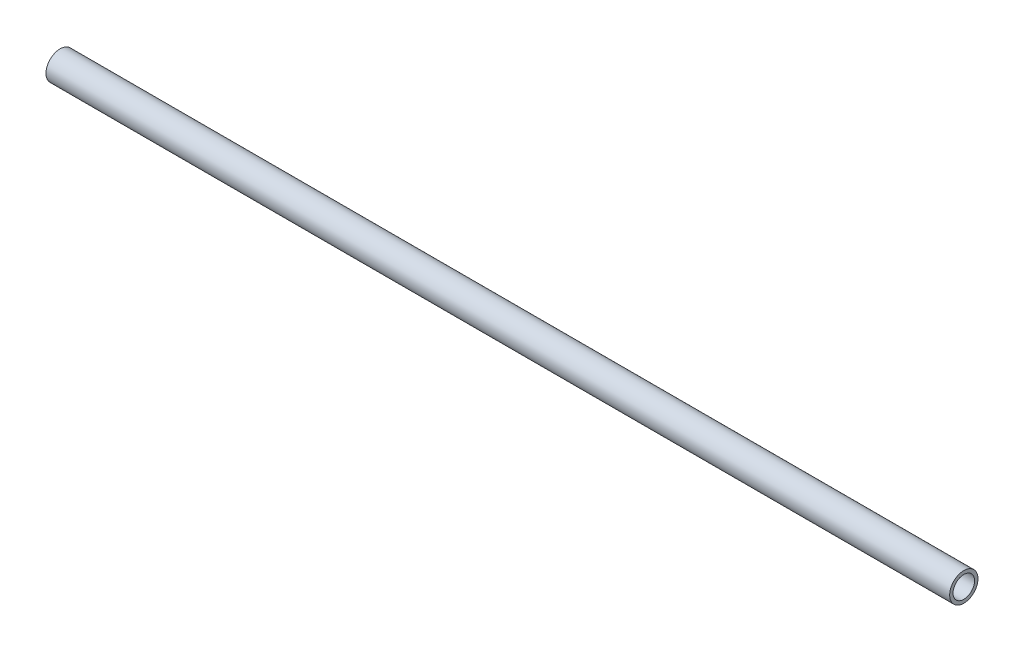
ISO-10303-21;
HEADER;
FILE_DESCRIPTION(('STEP AP214'),'2;1');
FILE_NAME('part.step','',(''),(''),'','','');
FILE_SCHEMA(('AUTOMOTIVE_DESIGN { 1 0 10303 214 1 1 1 1 }'));
ENDSEC;
DATA;
#1=APPLICATION_CONTEXT('core data for automotive mechanical design processes');
#2=APPLICATION_PROTOCOL_DEFINITION('international standard','automotive_design',2000,#1);
#3=PRODUCT_CONTEXT('',#1,'mechanical');
#4=PRODUCT('Part','Part','',(#3));
#5=PRODUCT_RELATED_PRODUCT_CATEGORY('part','',(#4));
#6=PRODUCT_DEFINITION_FORMATION('','',#4);
#7=PRODUCT_DEFINITION_CONTEXT('part definition',#1,'design');
#8=PRODUCT_DEFINITION('design','',#6,#7);
#9=PRODUCT_DEFINITION_SHAPE('','',#8);
#10=(LENGTH_UNIT() NAMED_UNIT(*) SI_UNIT(.MILLI.,.METRE.));
#11=(NAMED_UNIT(*) PLANE_ANGLE_UNIT() SI_UNIT($,.RADIAN.));
#12=(NAMED_UNIT(*) SI_UNIT($,.STERADIAN.) SOLID_ANGLE_UNIT());
#13=UNCERTAINTY_MEASURE_WITH_UNIT(LENGTH_MEASURE(1.E-05),#10,'distance_accuracy_value','');
#14=(GEOMETRIC_REPRESENTATION_CONTEXT(3) GLOBAL_UNCERTAINTY_ASSIGNED_CONTEXT((#13)) GLOBAL_UNIT_ASSIGNED_CONTEXT((#10,
#11,#12)) REPRESENTATION_CONTEXT('',''));
#15=CARTESIAN_POINT('',(0.,0.,0.));
#16=DIRECTION('',(0.,0.,1.));
#17=DIRECTION('',(1.,0.,0.));
#18=AXIS2_PLACEMENT_3D('',#15,#16,#17);
#19=CARTESIAN_POINT('',(810.,0.,0.));
#20=DIRECTION('',(1.,0.,0.));
#21=DIRECTION('',(0.,0.,-1.));
#22=AXIS2_PLACEMENT_3D('',#19,#20,#21);
#23=PLANE('',#22);
#24=CARTESIAN_POINT('',(810.,0.,0.));
#25=DIRECTION('',(1.,0.,0.));
#26=DIRECTION('',(0.,0.,-1.));
#27=AXIS2_PLACEMENT_3D('',#24,#25,#26);
#28=CIRCLE('',#27,12.7);
#29=CARTESIAN_POINT('',(810.,0.,-12.7));
#30=VERTEX_POINT('',#29);
#31=EDGE_CURVE('E10',#30,#30,#28,.T.);
#32=ORIENTED_EDGE('',*,*,#31,.T.);
#33=EDGE_LOOP('',(#32));
#34=FACE_BOUND('',#33,.T.);
#35=CARTESIAN_POINT('',(810.,0.,0.));
#36=DIRECTION('',(1.,0.,0.));
#37=DIRECTION('',(0.,0.,-1.));
#38=AXIS2_PLACEMENT_3D('',#35,#36,#37);
#39=CIRCLE('',#38,9.652);
#40=CARTESIAN_POINT('',(810.,0.,-9.652));
#41=VERTEX_POINT('',#40);
#42=EDGE_CURVE('E45',#41,#41,#39,.T.);
#43=ORIENTED_EDGE('',*,*,#42,.F.);
#44=EDGE_LOOP('',(#43));
#45=FACE_BOUND('',#44,.T.);
#46=ADVANCED_FACE('F34',(#34,#45),#23,.T.);
#47=CARTESIAN_POINT('',(0.,0.,0.));
#48=DIRECTION('',(1.,0.,0.));
#49=DIRECTION('',(0.,0.,-1.));
#50=AXIS2_PLACEMENT_3D('',#47,#48,#49);
#51=PLANE('',#50);
#52=CARTESIAN_POINT('',(0.,0.,0.));
#53=DIRECTION('',(1.,0.,0.));
#54=DIRECTION('',(0.,0.,-1.));
#55=AXIS2_PLACEMENT_3D('',#52,#53,#54);
#56=CIRCLE('',#55,12.7);
#57=CARTESIAN_POINT('',(0.,0.,-12.7));
#58=VERTEX_POINT('',#57);
#59=EDGE_CURVE('E38',#58,#58,#56,.T.);
#60=ORIENTED_EDGE('',*,*,#59,.F.);
#61=EDGE_LOOP('',(#60));
#62=FACE_BOUND('',#61,.T.);
#63=CARTESIAN_POINT('',(0.,0.,0.));
#64=DIRECTION('',(1.,0.,0.));
#65=DIRECTION('',(0.,0.,-1.));
#66=AXIS2_PLACEMENT_3D('',#63,#64,#65);
#67=CIRCLE('',#66,9.652);
#68=CARTESIAN_POINT('',(0.,0.,-9.652));
#69=VERTEX_POINT('',#68);
#70=EDGE_CURVE('E47',#69,#69,#67,.T.);
#71=ORIENTED_EDGE('',*,*,#70,.T.);
#72=EDGE_LOOP('',(#71));
#73=FACE_BOUND('',#72,.T.);
#74=ADVANCED_FACE('F57',(#62,#73),#51,.F.);
#75=CARTESIAN_POINT('',(810.,0.,0.));
#76=DIRECTION('',(-1.,0.,0.));
#77=DIRECTION('',(0.,0.,1.));
#78=AXIS2_PLACEMENT_3D('',#75,#76,#77);
#79=CYLINDRICAL_SURFACE('',#78,12.7);
#80=ORIENTED_EDGE('',*,*,#31,.F.);
#81=EDGE_LOOP('',(#80));
#82=FACE_BOUND('',#81,.T.);
#83=ORIENTED_EDGE('',*,*,#59,.T.);
#84=EDGE_LOOP('',(#83));
#85=FACE_BOUND('',#84,.T.);
#86=ADVANCED_FACE('F36',(#82,#85),#79,.T.);
#87=CARTESIAN_POINT('',(810.,0.,0.));
#88=DIRECTION('',(-1.,0.,0.));
#89=DIRECTION('',(0.,0.,1.));
#90=AXIS2_PLACEMENT_3D('',#87,#88,#89);
#91=CYLINDRICAL_SURFACE('',#90,9.652);
#92=ORIENTED_EDGE('',*,*,#42,.T.);
#93=EDGE_LOOP('',(#92));
#94=FACE_BOUND('',#93,.T.);
#95=ORIENTED_EDGE('',*,*,#70,.F.);
#96=EDGE_LOOP('',(#95));
#97=FACE_BOUND('',#96,.T.);
#98=ADVANCED_FACE('F53',(#94,#97),#91,.F.);
#99=CLOSED_SHELL('',(#46,#74,#86,#98));
#100=MANIFOLD_SOLID_BREP('B2',#99);
#101=ADVANCED_BREP_SHAPE_REPRESENTATION('',(#18,#100),#14);
#102=SHAPE_DEFINITION_REPRESENTATION(#9,#101);
ENDSEC;
END-ISO-10303-21;
